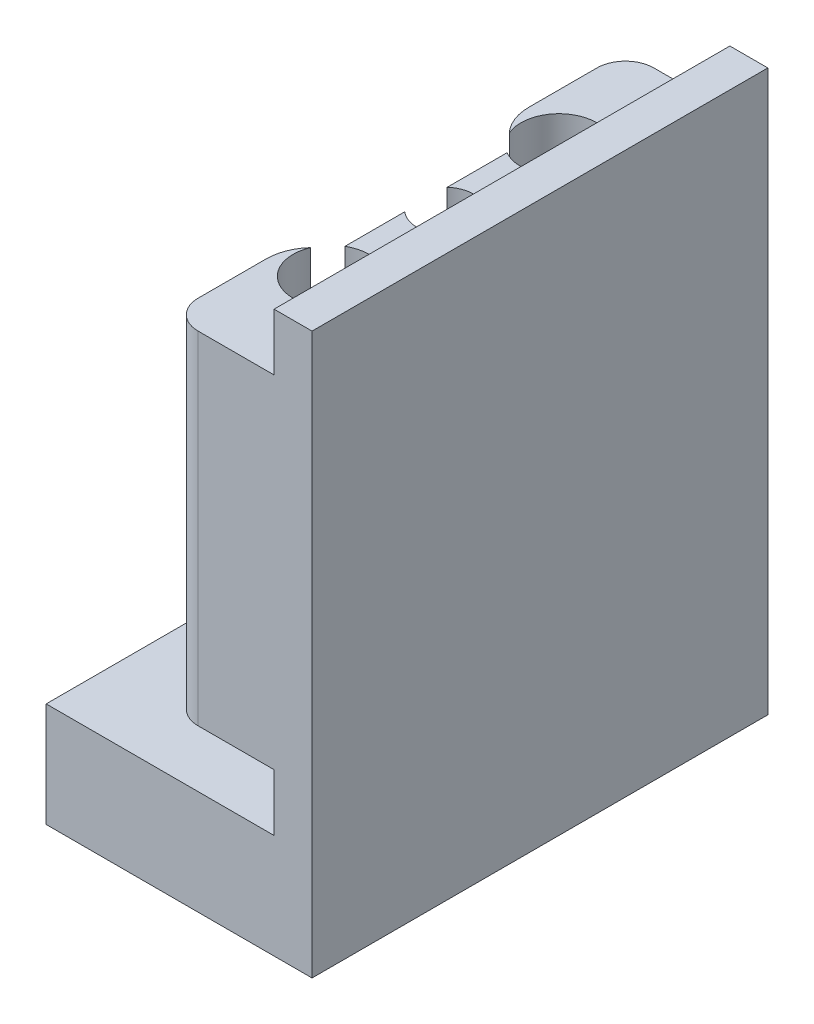
ISO-10303-21;
HEADER;
FILE_DESCRIPTION(('STEP AP214'),'2;1');
FILE_NAME('part.step','',(''),(''),'','','');
FILE_SCHEMA(('AUTOMOTIVE_DESIGN { 1 0 10303 214 1 1 1 1 }'));
ENDSEC;
DATA;
#1=APPLICATION_CONTEXT('core data for automotive mechanical design processes');
#2=APPLICATION_PROTOCOL_DEFINITION('international standard','automotive_design',2000,#1);
#3=PRODUCT_CONTEXT('',#1,'mechanical');
#4=PRODUCT('Part','Part','',(#3));
#5=PRODUCT_RELATED_PRODUCT_CATEGORY('part','',(#4));
#6=PRODUCT_DEFINITION_FORMATION('','',#4);
#7=PRODUCT_DEFINITION_CONTEXT('part definition',#1,'design');
#8=PRODUCT_DEFINITION('design','',#6,#7);
#9=PRODUCT_DEFINITION_SHAPE('','',#8);
#10=(LENGTH_UNIT() NAMED_UNIT(*) SI_UNIT(.MILLI.,.METRE.));
#11=(NAMED_UNIT(*) PLANE_ANGLE_UNIT() SI_UNIT($,.RADIAN.));
#12=(NAMED_UNIT(*) SI_UNIT($,.STERADIAN.) SOLID_ANGLE_UNIT());
#13=UNCERTAINTY_MEASURE_WITH_UNIT(LENGTH_MEASURE(1.E-05),#10,'distance_accuracy_value','');
#14=(GEOMETRIC_REPRESENTATION_CONTEXT(3) GLOBAL_UNCERTAINTY_ASSIGNED_CONTEXT((#13)) GLOBAL_UNIT_ASSIGNED_CONTEXT((#10,
#11,#12)) REPRESENTATION_CONTEXT('',''));
#15=CARTESIAN_POINT('',(0.,0.,0.));
#16=DIRECTION('',(0.,0.,1.));
#17=DIRECTION('',(1.,0.,0.));
#18=AXIS2_PLACEMENT_3D('',#15,#16,#17);
#19=CARTESIAN_POINT('',(2.,0.,0.));
#20=DIRECTION('',(-1.,0.,0.));
#21=DIRECTION('',(0.,0.,1.));
#22=AXIS2_PLACEMENT_3D('',#19,#20,#21);
#23=PLANE('',#22);
#24=DIRECTION('',(0.,1.,0.));
#25=VECTOR('',#24,1.);
#26=CARTESIAN_POINT('',(2.,0.,4.26794919243112));
#27=LINE('',#26,#25);
#28=CARTESIAN_POINT('',(2.,26.5,4.26794919243112));
#29=VERTEX_POINT('',#28);
#30=CARTESIAN_POINT('',(2.,8.5,4.26794919243112));
#31=VERTEX_POINT('',#30);
#32=EDGE_CURVE('E589',#29,#31,#27,.F.);
#33=ORIENTED_EDGE('',*,*,#32,.F.);
#34=DIRECTION('',(0.,0.,-1.));
#35=VECTOR('',#34,1.);
#36=CARTESIAN_POINT('',(2.,26.5,-4.625));
#37=LINE('',#36,#35);
#38=CARTESIAN_POINT('',(2.,26.5,1.1180339887499));
#39=VERTEX_POINT('',#38);
#40=EDGE_CURVE('E198',#29,#39,#37,.T.);
#41=ORIENTED_EDGE('',*,*,#40,.T.);
#42=DIRECTION('',(0.,1.,0.));
#43=VECTOR('',#42,1.);
#44=CARTESIAN_POINT('',(2.,0.,1.1180339887499));
#45=LINE('',#44,#43);
#46=CARTESIAN_POINT('',(2.,8.5,1.1180339887499));
#47=VERTEX_POINT('',#46);
#48=EDGE_CURVE('E292',#47,#39,#45,.T.);
#49=ORIENTED_EDGE('',*,*,#48,.F.);
#50=DIRECTION('',(0.,0.,1.));
#51=VECTOR('',#50,1.);
#52=CARTESIAN_POINT('',(2.,8.5,-4.625));
#53=LINE('',#52,#51);
#54=EDGE_CURVE('E203',#47,#31,#53,.T.);
#55=ORIENTED_EDGE('',*,*,#54,.T.);
#56=EDGE_LOOP('',(#33,#41,#49,#55));
#57=FACE_BOUND('',#56,.T.);
#58=ADVANCED_FACE('F35',(#57),#23,.T.);
#59=CARTESIAN_POINT('',(0.500000000000001,26.5,12.));
#60=DIRECTION('',(1.,0.,0.));
#61=DIRECTION('',(0.,0.,-1.));
#62=AXIS2_PLACEMENT_3D('',#59,#60,#61);
#63=PLANE('',#62);
#64=DIRECTION('',(0.,0.,1.));
#65=VECTOR('',#64,1.);
#66=CARTESIAN_POINT('',(0.500000000000001,26.5,12.));
#67=LINE('',#66,#65);
#68=CARTESIAN_POINT('',(0.500000000000001,26.5,-10.5));
#69=VERTEX_POINT('',#68);
#70=CARTESIAN_POINT('',(0.500000000000001,26.5,-6.91628784747792));
#71=VERTEX_POINT('',#70);
#72=EDGE_CURVE('E214',#69,#71,#67,.T.);
#73=ORIENTED_EDGE('',*,*,#72,.F.);
#74=DIRECTION('',(0.,-1.,0.));
#75=VECTOR('',#74,1.);
#76=CARTESIAN_POINT('',(0.500000000000001,26.5,-10.5));
#77=LINE('',#76,#75);
#78=CARTESIAN_POINT('',(0.500000000000001,8.5,-10.5));
#79=VERTEX_POINT('',#78);
#80=EDGE_CURVE('E294',#69,#79,#77,.T.);
#81=ORIENTED_EDGE('',*,*,#80,.T.);
#82=DIRECTION('',(0.,0.,1.));
#83=VECTOR('',#82,1.);
#84=CARTESIAN_POINT('',(0.500000000000001,8.5,12.));
#85=LINE('',#84,#83);
#86=CARTESIAN_POINT('',(0.500000000000001,8.5,-6.91628784747792));
#87=VERTEX_POINT('',#86);
#88=EDGE_CURVE('E224',#79,#87,#85,.T.);
#89=ORIENTED_EDGE('',*,*,#88,.T.);
#90=DIRECTION('',(0.,1.,0.));
#91=VECTOR('',#90,1.);
#92=CARTESIAN_POINT('',(0.500000000000001,26.5,-6.91628784747792));
#93=LINE('',#92,#91);
#94=EDGE_CURVE('E284',#87,#71,#93,.T.);
#95=ORIENTED_EDGE('',*,*,#94,.T.);
#96=EDGE_LOOP('',(#73,#81,#89,#95));
#97=FACE_BOUND('',#96,.T.);
#98=ADVANCED_FACE('F359',(#97),#63,.F.);
#99=CARTESIAN_POINT('',(6.,29.5,12.));
#100=DIRECTION('',(1.,0.,0.));
#101=DIRECTION('',(0.,0.,-1.));
#102=AXIS2_PLACEMENT_3D('',#99,#100,#101);
#103=PLANE('',#102);
#104=DIRECTION('',(0.,0.,-1.));
#105=VECTOR('',#104,1.);
#106=CARTESIAN_POINT('',(6.,8.5,12.));
#107=LINE('',#106,#105);
#108=CARTESIAN_POINT('',(6.,8.5,12.));
#109=VERTEX_POINT('',#108);
#110=CARTESIAN_POINT('',(6.,8.5,-12.));
#111=VERTEX_POINT('',#110);
#112=EDGE_CURVE('E202',#109,#111,#107,.T.);
#113=ORIENTED_EDGE('',*,*,#112,.T.);
#114=DIRECTION('',(0.,-1.,0.));
#115=VECTOR('',#114,1.);
#116=CARTESIAN_POINT('',(6.,29.5,-12.));
#117=LINE('',#116,#115);
#118=CARTESIAN_POINT('',(6.,5.5,-12.));
#119=VERTEX_POINT('',#118);
#120=EDGE_CURVE('E236',#111,#119,#117,.T.);
#121=ORIENTED_EDGE('',*,*,#120,.T.);
#122=DIRECTION('',(0.,0.,-1.));
#123=VECTOR('',#122,1.);
#124=CARTESIAN_POINT('',(6.,5.5,12.));
#125=LINE('',#124,#123);
#126=CARTESIAN_POINT('',(6.,5.5,12.));
#127=VERTEX_POINT('',#126);
#128=EDGE_CURVE('E252',#127,#119,#125,.T.);
#129=ORIENTED_EDGE('',*,*,#128,.F.);
#130=DIRECTION('',(0.,-1.,0.));
#131=VECTOR('',#130,1.);
#132=CARTESIAN_POINT('',(6.,29.5,12.));
#133=LINE('',#132,#131);
#134=EDGE_CURVE('E247',#109,#127,#133,.T.);
#135=ORIENTED_EDGE('',*,*,#134,.F.);
#136=EDGE_LOOP('',(#113,#121,#129,#135));
#137=FACE_BOUND('',#136,.T.);
#138=ADVANCED_FACE('F320',(#137),#103,.F.);
#139=CARTESIAN_POINT('',(-6.,5.5,-12.));
#140=DIRECTION('',(0.,0.,1.));
#141=DIRECTION('',(1.,0.,0.));
#142=AXIS2_PLACEMENT_3D('',#139,#140,#141);
#143=PLANE('',#142);
#144=DIRECTION('',(-1.,0.,0.));
#145=VECTOR('',#144,1.);
#146=CARTESIAN_POINT('',(6.,8.5,-12.));
#147=LINE('',#146,#145);
#148=CARTESIAN_POINT('',(2.,8.5,-12.));
#149=VERTEX_POINT('',#148);
#150=EDGE_CURVE('E220',#111,#149,#147,.T.);
#151=ORIENTED_EDGE('',*,*,#150,.T.);
#152=DIRECTION('',(0.,-1.,0.));
#153=VECTOR('',#152,1.);
#154=CARTESIAN_POINT('',(2.,5.5,-12.));
#155=LINE('',#154,#153);
#156=CARTESIAN_POINT('',(2.,26.5,-12.));
#157=VERTEX_POINT('',#156);
#158=EDGE_CURVE('E301',#149,#157,#155,.F.);
#159=ORIENTED_EDGE('',*,*,#158,.T.);
#160=DIRECTION('',(-1.,0.,0.));
#161=VECTOR('',#160,1.);
#162=CARTESIAN_POINT('',(6.,26.5,-12.));
#163=LINE('',#162,#161);
#164=CARTESIAN_POINT('',(6.,26.5,-12.));
#165=VERTEX_POINT('',#164);
#166=EDGE_CURVE('E210',#165,#157,#163,.T.);
#167=ORIENTED_EDGE('',*,*,#166,.F.);
#168=CARTESIAN_POINT('',(6.,29.5,-12.));
#169=VERTEX_POINT('',#168);
#170=EDGE_CURVE('E239',#169,#165,#117,.T.);
#171=ORIENTED_EDGE('',*,*,#170,.F.);
#172=DIRECTION('',(-1.,0.,0.));
#173=VECTOR('',#172,1.);
#174=CARTESIAN_POINT('',(6.,29.5,-12.));
#175=LINE('',#174,#173);
#176=CARTESIAN_POINT('',(8.,29.5,-12.));
#177=VERTEX_POINT('',#176);
#178=EDGE_CURVE('E234',#177,#169,#175,.T.);
#179=ORIENTED_EDGE('',*,*,#178,.F.);
#180=DIRECTION('',(0.,-1.,0.));
#181=VECTOR('',#180,1.);
#182=CARTESIAN_POINT('',(8.,29.5,-12.));
#183=LINE('',#182,#181);
#184=CARTESIAN_POINT('',(8.,0.,-12.));
#185=VERTEX_POINT('',#184);
#186=EDGE_CURVE('E241',#177,#185,#183,.T.);
#187=ORIENTED_EDGE('',*,*,#186,.T.);
#188=DIRECTION('',(-1.,0.,0.));
#189=VECTOR('',#188,1.);
#190=CARTESIAN_POINT('',(-6.,0.,-12.));
#191=LINE('',#190,#189);
#192=CARTESIAN_POINT('',(-6.,0.,-12.));
#193=VERTEX_POINT('',#192);
#194=EDGE_CURVE('E251',#185,#193,#191,.T.);
#195=ORIENTED_EDGE('',*,*,#194,.T.);
#196=DIRECTION('',(0.,-1.,0.));
#197=VECTOR('',#196,1.);
#198=CARTESIAN_POINT('',(-6.,5.5,-12.));
#199=LINE('',#198,#197);
#200=CARTESIAN_POINT('',(-6.,5.5,-12.));
#201=VERTEX_POINT('',#200);
#202=EDGE_CURVE('E270',#201,#193,#199,.T.);
#203=ORIENTED_EDGE('',*,*,#202,.F.);
#204=DIRECTION('',(-1.,0.,0.));
#205=VECTOR('',#204,1.);
#206=CARTESIAN_POINT('',(-6.,5.5,-12.));
#207=LINE('',#206,#205);
#208=EDGE_CURVE('E255',#119,#201,#207,.T.);
#209=ORIENTED_EDGE('',*,*,#208,.F.);
#210=ORIENTED_EDGE('',*,*,#120,.F.);
#211=EDGE_LOOP('',(#151,#159,#167,#171,#179,#187,#195,#203,#209,#210));
#212=FACE_BOUND('',#211,.T.);
#213=ADVANCED_FACE('F324',(#212),#143,.F.);
#214=CARTESIAN_POINT('',(-6.,5.5,12.));
#215=DIRECTION('',(1.,0.,0.));
#216=DIRECTION('',(0.,0.,-1.));
#217=AXIS2_PLACEMENT_3D('',#214,#215,#216);
#218=PLANE('',#217);
#219=DIRECTION('',(0.,0.,1.));
#220=VECTOR('',#219,1.);
#221=CARTESIAN_POINT('',(-6.,0.,12.));
#222=LINE('',#221,#220);
#223=CARTESIAN_POINT('',(-6.,0.,12.));
#224=VERTEX_POINT('',#223);
#225=EDGE_CURVE('E265',#193,#224,#222,.T.);
#226=ORIENTED_EDGE('',*,*,#225,.T.);
#227=DIRECTION('',(0.,-1.,0.));
#228=VECTOR('',#227,1.);
#229=CARTESIAN_POINT('',(-6.,5.5,12.));
#230=LINE('',#229,#228);
#231=CARTESIAN_POINT('',(-6.,5.5,12.));
#232=VERTEX_POINT('',#231);
#233=EDGE_CURVE('E263',#232,#224,#230,.T.);
#234=ORIENTED_EDGE('',*,*,#233,.F.);
#235=DIRECTION('',(0.,0.,1.));
#236=VECTOR('',#235,1.);
#237=CARTESIAN_POINT('',(-6.,5.5,12.));
#238=LINE('',#237,#236);
#239=EDGE_CURVE('E258',#201,#232,#238,.T.);
#240=ORIENTED_EDGE('',*,*,#239,.F.);
#241=ORIENTED_EDGE('',*,*,#202,.T.);
#242=EDGE_LOOP('',(#226,#234,#240,#241));
#243=FACE_BOUND('',#242,.T.);
#244=ADVANCED_FACE('F411',(#243),#218,.F.);
#245=CARTESIAN_POINT('',(-6.,5.5,12.));
#246=DIRECTION('',(0.,0.,-1.));
#247=DIRECTION('',(-1.,0.,0.));
#248=AXIS2_PLACEMENT_3D('',#245,#246,#247);
#249=PLANE('',#248);
#250=DIRECTION('',(1.,0.,0.));
#251=VECTOR('',#250,1.);
#252=CARTESIAN_POINT('',(6.,26.5,12.));
#253=LINE('',#252,#251);
#254=CARTESIAN_POINT('',(2.,26.5,12.));
#255=VERTEX_POINT('',#254);
#256=CARTESIAN_POINT('',(6.,26.5,12.));
#257=VERTEX_POINT('',#256);
#258=EDGE_CURVE('E216',#255,#257,#253,.T.);
#259=ORIENTED_EDGE('',*,*,#258,.F.);
#260=DIRECTION('',(0.,-1.,0.));
#261=VECTOR('',#260,1.);
#262=CARTESIAN_POINT('',(2.,5.5,12.));
#263=LINE('',#262,#261);
#264=CARTESIAN_POINT('',(2.,8.5,12.));
#265=VERTEX_POINT('',#264);
#266=EDGE_CURVE('E43',#255,#265,#263,.T.);
#267=ORIENTED_EDGE('',*,*,#266,.T.);
#268=DIRECTION('',(1.,0.,0.));
#269=VECTOR('',#268,1.);
#270=CARTESIAN_POINT('',(6.,8.5,12.));
#271=LINE('',#270,#269);
#272=EDGE_CURVE('E211',#265,#109,#271,.T.);
#273=ORIENTED_EDGE('',*,*,#272,.T.);
#274=ORIENTED_EDGE('',*,*,#134,.T.);
#275=DIRECTION('',(1.,0.,0.));
#276=VECTOR('',#275,1.);
#277=CARTESIAN_POINT('',(-6.,5.5,12.));
#278=LINE('',#277,#276);
#279=EDGE_CURVE('E260',#232,#127,#278,.T.);
#280=ORIENTED_EDGE('',*,*,#279,.F.);
#281=ORIENTED_EDGE('',*,*,#233,.T.);
#282=DIRECTION('',(1.,0.,0.));
#283=VECTOR('',#282,1.);
#284=CARTESIAN_POINT('',(-6.,0.,12.));
#285=LINE('',#284,#283);
#286=CARTESIAN_POINT('',(8.,0.,12.));
#287=VERTEX_POINT('',#286);
#288=EDGE_CURVE('E256',#224,#287,#285,.T.);
#289=ORIENTED_EDGE('',*,*,#288,.T.);
#290=DIRECTION('',(0.,-1.,0.));
#291=VECTOR('',#290,1.);
#292=CARTESIAN_POINT('',(8.,29.5,12.));
#293=LINE('',#292,#291);
#294=CARTESIAN_POINT('',(8.,29.5,12.));
#295=VERTEX_POINT('',#294);
#296=EDGE_CURVE('E244',#295,#287,#293,.T.);
#297=ORIENTED_EDGE('',*,*,#296,.F.);
#298=DIRECTION('',(1.,0.,0.));
#299=VECTOR('',#298,1.);
#300=CARTESIAN_POINT('',(6.,29.5,12.));
#301=LINE('',#300,#299);
#302=CARTESIAN_POINT('',(6.,29.5,12.));
#303=VERTEX_POINT('',#302);
#304=EDGE_CURVE('E230',#303,#295,#301,.T.);
#305=ORIENTED_EDGE('',*,*,#304,.F.);
#306=EDGE_CURVE('E248',#303,#257,#133,.T.);
#307=ORIENTED_EDGE('',*,*,#306,.T.);
#308=EDGE_LOOP('',(#259,#267,#273,#274,#280,#281,#289,#297,#305,#307));
#309=FACE_BOUND('',#308,.T.);
#310=ADVANCED_FACE('F309',(#309),#249,.F.);
#311=CARTESIAN_POINT('',(0.,5.5,0.));
#312=DIRECTION('',(0.,-1.,0.));
#313=DIRECTION('',(0.,0.,-1.));
#314=AXIS2_PLACEMENT_3D('',#311,#312,#313);
#315=PLANE('',#314);
#316=CARTESIAN_POINT('',(3.,5.5,6.));
#317=DIRECTION('',(0.,-1.,0.));
#318=DIRECTION('',(0.,0.,-1.));
#319=AXIS2_PLACEMENT_3D('',#316,#317,#318);
#320=CIRCLE('',#319,2.);
#321=CARTESIAN_POINT('',(3.,5.5,4.));
#322=VERTEX_POINT('',#321);
#323=EDGE_CURVE('E597',#322,#322,#320,.T.);
#324=ORIENTED_EDGE('',*,*,#323,.T.);
#325=EDGE_LOOP('',(#324));
#326=FACE_BOUND('',#325,.T.);
#327=CARTESIAN_POINT('',(3.,5.5,-6.));
#328=DIRECTION('',(0.,-1.,0.));
#329=DIRECTION('',(0.,0.,-1.));
#330=AXIS2_PLACEMENT_3D('',#327,#328,#329);
#331=CIRCLE('',#330,2.);
#332=CARTESIAN_POINT('',(3.,5.5,-8.));
#333=VERTEX_POINT('',#332);
#334=EDGE_CURVE('E182',#333,#333,#331,.T.);
#335=ORIENTED_EDGE('',*,*,#334,.T.);
#336=EDGE_LOOP('',(#335));
#337=FACE_BOUND('',#336,.T.);
#338=CARTESIAN_POINT('',(3.,5.5,0.));
#339=DIRECTION('',(0.,-1.,0.));
#340=DIRECTION('',(0.,0.,-1.));
#341=AXIS2_PLACEMENT_3D('',#338,#339,#340);
#342=CIRCLE('',#341,1.5);
#343=CARTESIAN_POINT('',(3.,5.5,-1.5));
#344=VERTEX_POINT('',#343);
#345=EDGE_CURVE('E604',#344,#344,#342,.T.);
#346=ORIENTED_EDGE('',*,*,#345,.T.);
#347=EDGE_LOOP('',(#346));
#348=FACE_BOUND('',#347,.T.);
#349=ORIENTED_EDGE('',*,*,#128,.T.);
#350=ORIENTED_EDGE('',*,*,#208,.T.);
#351=ORIENTED_EDGE('',*,*,#239,.T.);
#352=ORIENTED_EDGE('',*,*,#279,.T.);
#353=EDGE_LOOP('',(#349,#350,#351,#352));
#354=FACE_BOUND('',#353,.T.);
#355=ADVANCED_FACE('F329',(#326,#337,#348,#354),#315,.F.);
#356=CARTESIAN_POINT('',(0.,0.,0.));
#357=DIRECTION('',(0.,-1.,0.));
#358=DIRECTION('',(0.,0.,-1.));
#359=AXIS2_PLACEMENT_3D('',#356,#357,#358);
#360=PLANE('',#359);
#361=CARTESIAN_POINT('',(3.,0.,6.));
#362=DIRECTION('',(0.,1.,0.));
#363=DIRECTION('',(0.,0.,1.));
#364=AXIS2_PLACEMENT_3D('',#361,#362,#363);
#365=CIRCLE('',#364,2.);
#366=CARTESIAN_POINT('',(3.,0.,8.));
#367=VERTEX_POINT('',#366);
#368=EDGE_CURVE('E616',#367,#367,#365,.T.);
#369=ORIENTED_EDGE('',*,*,#368,.T.);
#370=EDGE_LOOP('',(#369));
#371=FACE_BOUND('',#370,.T.);
#372=CARTESIAN_POINT('',(3.,0.,-6.));
#373=DIRECTION('',(0.,1.,0.));
#374=DIRECTION('',(0.,0.,-1.));
#375=AXIS2_PLACEMENT_3D('',#372,#373,#374);
#376=CIRCLE('',#375,2.);
#377=CARTESIAN_POINT('',(3.,0.,-8.));
#378=VERTEX_POINT('',#377);
#379=EDGE_CURVE('E192',#378,#378,#376,.T.);
#380=ORIENTED_EDGE('',*,*,#379,.T.);
#381=EDGE_LOOP('',(#380));
#382=FACE_BOUND('',#381,.T.);
#383=CARTESIAN_POINT('',(3.,0.,0.));
#384=DIRECTION('',(0.,1.,0.));
#385=DIRECTION('',(0.,0.,1.));
#386=AXIS2_PLACEMENT_3D('',#383,#384,#385);
#387=CIRCLE('',#386,1.5);
#388=CARTESIAN_POINT('',(3.,0.,1.5));
#389=VERTEX_POINT('',#388);
#390=EDGE_CURVE('E193',#389,#389,#387,.T.);
#391=ORIENTED_EDGE('',*,*,#390,.T.);
#392=EDGE_LOOP('',(#391));
#393=FACE_BOUND('',#392,.T.);
#394=ORIENTED_EDGE('',*,*,#194,.F.);
#395=DIRECTION('',(0.,0.,-1.));
#396=VECTOR('',#395,1.);
#397=CARTESIAN_POINT('',(8.,0.,12.));
#398=LINE('',#397,#396);
#399=EDGE_CURVE('E218',#287,#185,#398,.T.);
#400=ORIENTED_EDGE('',*,*,#399,.F.);
#401=ORIENTED_EDGE('',*,*,#288,.F.);
#402=ORIENTED_EDGE('',*,*,#225,.F.);
#403=EDGE_LOOP('',(#394,#400,#401,#402));
#404=FACE_BOUND('',#403,.T.);
#405=ADVANCED_FACE('F338',(#371,#382,#393,#404),#360,.T.);
#406=ORIENTED_EDGE('',*,*,#170,.T.);
#407=DIRECTION('',(0.,0.,-1.));
#408=VECTOR('',#407,1.);
#409=CARTESIAN_POINT('',(6.,26.5,12.));
#410=LINE('',#409,#408);
#411=EDGE_CURVE('E207',#257,#165,#410,.T.);
#412=ORIENTED_EDGE('',*,*,#411,.F.);
#413=ORIENTED_EDGE('',*,*,#306,.F.);
#414=DIRECTION('',(0.,0.,1.));
#415=VECTOR('',#414,1.);
#416=CARTESIAN_POINT('',(6.,29.5,12.));
#417=LINE('',#416,#415);
#418=EDGE_CURVE('E227',#169,#303,#417,.T.);
#419=ORIENTED_EDGE('',*,*,#418,.F.);
#420=EDGE_LOOP('',(#406,#412,#413,#419));
#421=FACE_BOUND('',#420,.T.);
#422=ADVANCED_FACE('F352',(#421),#103,.F.);
#423=CARTESIAN_POINT('',(8.,29.5,12.));
#424=DIRECTION('',(-1.,0.,0.));
#425=DIRECTION('',(0.,0.,1.));
#426=AXIS2_PLACEMENT_3D('',#423,#424,#425);
#427=PLANE('',#426);
#428=ORIENTED_EDGE('',*,*,#399,.T.);
#429=ORIENTED_EDGE('',*,*,#186,.F.);
#430=DIRECTION('',(0.,0.,-1.));
#431=VECTOR('',#430,1.);
#432=CARTESIAN_POINT('',(8.,29.5,12.));
#433=LINE('',#432,#431);
#434=EDGE_CURVE('E232',#295,#177,#433,.T.);
#435=ORIENTED_EDGE('',*,*,#434,.F.);
#436=ORIENTED_EDGE('',*,*,#296,.T.);
#437=EDGE_LOOP('',(#428,#429,#435,#436));
#438=FACE_BOUND('',#437,.T.);
#439=ADVANCED_FACE('F341',(#438),#427,.F.);
#440=CARTESIAN_POINT('',(0.,29.5,0.));
#441=DIRECTION('',(0.,-1.,0.));
#442=DIRECTION('',(0.,0.,-1.));
#443=AXIS2_PLACEMENT_3D('',#440,#441,#442);
#444=PLANE('',#443);
#445=ORIENTED_EDGE('',*,*,#418,.T.);
#446=ORIENTED_EDGE('',*,*,#304,.T.);
#447=ORIENTED_EDGE('',*,*,#434,.T.);
#448=ORIENTED_EDGE('',*,*,#178,.T.);
#449=EDGE_LOOP('',(#445,#446,#447,#448));
#450=FACE_BOUND('',#449,.T.);
#451=ADVANCED_FACE('F348',(#450),#444,.F.);
#452=CARTESIAN_POINT('',(0.500000000000001,8.5,6.91628784747793));
#453=VERTEX_POINT('',#452);
#454=CARTESIAN_POINT('',(0.500000000000001,8.5,10.5));
#455=VERTEX_POINT('',#454);
#456=EDGE_CURVE('E223',#453,#455,#85,.T.);
#457=ORIENTED_EDGE('',*,*,#456,.T.);
#458=DIRECTION('',(0.,-1.,0.));
#459=VECTOR('',#458,1.);
#460=CARTESIAN_POINT('',(0.500000000000001,26.5,10.5));
#461=LINE('',#460,#459);
#462=CARTESIAN_POINT('',(0.500000000000001,26.5,10.5));
#463=VERTEX_POINT('',#462);
#464=EDGE_CURVE('E11',#455,#463,#461,.F.);
#465=ORIENTED_EDGE('',*,*,#464,.T.);
#466=CARTESIAN_POINT('',(0.500000000000001,26.5,6.91628784747792));
#467=VERTEX_POINT('',#466);
#468=EDGE_CURVE('E213',#467,#463,#67,.T.);
#469=ORIENTED_EDGE('',*,*,#468,.F.);
#470=DIRECTION('',(0.,-1.,0.));
#471=VECTOR('',#470,1.);
#472=CARTESIAN_POINT('',(0.500000000000001,26.5,6.91628784747792));
#473=LINE('',#472,#471);
#474=EDGE_CURVE('E276',#467,#453,#473,.T.);
#475=ORIENTED_EDGE('',*,*,#474,.T.);
#476=EDGE_LOOP('',(#457,#465,#469,#475));
#477=FACE_BOUND('',#476,.T.);
#478=ADVANCED_FACE('F383',(#477),#63,.F.);
#479=CARTESIAN_POINT('',(0.,26.5,0.));
#480=DIRECTION('',(0.,1.,0.));
#481=DIRECTION('',(0.,0.,1.));
#482=AXIS2_PLACEMENT_3D('',#479,#480,#481);
#483=PLANE('',#482);
#484=ORIENTED_EDGE('',*,*,#166,.T.);
#485=CARTESIAN_POINT('',(2.,26.5,-10.5));
#486=DIRECTION('',(0.,1.,0.));
#487=DIRECTION('',(0.,0.,1.));
#488=AXIS2_PLACEMENT_3D('',#485,#486,#487);
#489=CIRCLE('',#488,1.5);
#490=EDGE_CURVE('E304',#157,#69,#489,.T.);
#491=ORIENTED_EDGE('',*,*,#490,.T.);
#492=ORIENTED_EDGE('',*,*,#72,.T.);
#493=CARTESIAN_POINT('',(3.,26.5,-6.91628784747792));
#494=DIRECTION('',(0.,1.,0.));
#495=DIRECTION('',(0.,0.,1.));
#496=AXIS2_PLACEMENT_3D('',#493,#494,#495);
#497=CIRCLE('',#496,2.5);
#498=CARTESIAN_POINT('',(1.15401513251041,26.5,-5.23036380737426));
#499=VERTEX_POINT('',#498);
#500=EDGE_CURVE('E191',#71,#499,#497,.T.);
#501=ORIENTED_EDGE('',*,*,#500,.T.);
#502=CARTESIAN_POINT('',(3.,26.5,-6.));
#503=DIRECTION('',(0.,1.,0.));
#504=DIRECTION('',(0.,0.,-1.));
#505=AXIS2_PLACEMENT_3D('',#502,#503,#504);
#506=CIRCLE('',#505,2.);
#507=CARTESIAN_POINT('',(2.,26.5,-4.26794919243112));
#508=VERTEX_POINT('',#507);
#509=EDGE_CURVE('E174',#508,#499,#506,.T.);
#510=ORIENTED_EDGE('',*,*,#509,.F.);
#511=CARTESIAN_POINT('',(2.,26.5,-1.11803398874989));
#512=VERTEX_POINT('',#511);
#513=EDGE_CURVE('E189',#512,#508,#37,.T.);
#514=ORIENTED_EDGE('',*,*,#513,.F.);
#515=CARTESIAN_POINT('',(3.,26.5,0.));
#516=DIRECTION('',(0.,1.,0.));
#517=DIRECTION('',(0.,0.,1.));
#518=AXIS2_PLACEMENT_3D('',#515,#516,#517);
#519=CIRCLE('',#518,1.5);
#520=EDGE_CURVE('E617',#39,#512,#519,.T.);
#521=ORIENTED_EDGE('',*,*,#520,.F.);
#522=ORIENTED_EDGE('',*,*,#40,.F.);
#523=CARTESIAN_POINT('',(3.,26.5,6.));
#524=DIRECTION('',(0.,1.,0.));
#525=DIRECTION('',(0.,0.,1.));
#526=AXIS2_PLACEMENT_3D('',#523,#524,#525);
#527=CIRCLE('',#526,2.);
#528=CARTESIAN_POINT('',(1.15401513251041,26.5,5.23036380737426));
#529=VERTEX_POINT('',#528);
#530=EDGE_CURVE('E594',#529,#29,#527,.T.);
#531=ORIENTED_EDGE('',*,*,#530,.F.);
#532=CARTESIAN_POINT('',(3.,26.5,6.91628784747792));
#533=DIRECTION('',(0.,1.,0.));
#534=DIRECTION('',(0.,0.,1.));
#535=AXIS2_PLACEMENT_3D('',#532,#533,#534);
#536=CIRCLE('',#535,2.5);
#537=EDGE_CURVE('E274',#529,#467,#536,.T.);
#538=ORIENTED_EDGE('',*,*,#537,.T.);
#539=ORIENTED_EDGE('',*,*,#468,.T.);
#540=CARTESIAN_POINT('',(2.,26.5,10.5));
#541=DIRECTION('',(0.,1.,0.));
#542=DIRECTION('',(0.,0.,1.));
#543=AXIS2_PLACEMENT_3D('',#540,#541,#542);
#544=CIRCLE('',#543,1.5);
#545=EDGE_CURVE('E50',#463,#255,#544,.T.);
#546=ORIENTED_EDGE('',*,*,#545,.T.);
#547=ORIENTED_EDGE('',*,*,#258,.T.);
#548=ORIENTED_EDGE('',*,*,#411,.T.);
#549=EDGE_LOOP('',(#484,#491,#492,#501,#510,#514,#521,#522,#531,#538,#539,#546,#547,#548));
#550=FACE_BOUND('',#549,.T.);
#551=ADVANCED_FACE('F187',(#550),#483,.T.);
#552=CARTESIAN_POINT('',(0.,8.5,0.));
#553=DIRECTION('',(0.,1.,0.));
#554=DIRECTION('',(0.,0.,1.));
#555=AXIS2_PLACEMENT_3D('',#552,#553,#554);
#556=PLANE('',#555);
#557=ORIENTED_EDGE('',*,*,#88,.F.);
#558=CARTESIAN_POINT('',(2.,8.5,-10.5));
#559=DIRECTION('',(0.,1.,0.));
#560=DIRECTION('',(0.,0.,1.));
#561=AXIS2_PLACEMENT_3D('',#558,#559,#560);
#562=CIRCLE('',#561,1.5);
#563=EDGE_CURVE('E299',#79,#149,#562,.F.);
#564=ORIENTED_EDGE('',*,*,#563,.T.);
#565=ORIENTED_EDGE('',*,*,#150,.F.);
#566=ORIENTED_EDGE('',*,*,#112,.F.);
#567=ORIENTED_EDGE('',*,*,#272,.F.);
#568=CARTESIAN_POINT('',(2.,8.5,10.5));
#569=DIRECTION('',(0.,1.,0.));
#570=DIRECTION('',(0.,0.,1.));
#571=AXIS2_PLACEMENT_3D('',#568,#569,#570);
#572=CIRCLE('',#571,1.5);
#573=EDGE_CURVE('E297',#265,#455,#572,.F.);
#574=ORIENTED_EDGE('',*,*,#573,.T.);
#575=ORIENTED_EDGE('',*,*,#456,.F.);
#576=CARTESIAN_POINT('',(3.,8.5,6.91628784747793));
#577=DIRECTION('',(0.,1.,0.));
#578=DIRECTION('',(0.,0.,1.));
#579=AXIS2_PLACEMENT_3D('',#576,#577,#578);
#580=CIRCLE('',#579,2.5);
#581=CARTESIAN_POINT('',(1.15401513251041,8.5,5.23036380737427));
#582=VERTEX_POINT('',#581);
#583=EDGE_CURVE('E281',#453,#582,#580,.F.);
#584=ORIENTED_EDGE('',*,*,#583,.T.);
#585=CARTESIAN_POINT('',(3.,8.5,6.));
#586=DIRECTION('',(0.,1.,0.));
#587=DIRECTION('',(0.,0.,1.));
#588=AXIS2_PLACEMENT_3D('',#585,#586,#587);
#589=CIRCLE('',#588,2.);
#590=EDGE_CURVE('E591',#582,#31,#589,.T.);
#591=ORIENTED_EDGE('',*,*,#590,.T.);
#592=ORIENTED_EDGE('',*,*,#54,.F.);
#593=CARTESIAN_POINT('',(3.,8.5,0.));
#594=DIRECTION('',(0.,1.,0.));
#595=DIRECTION('',(0.,0.,1.));
#596=AXIS2_PLACEMENT_3D('',#593,#594,#595);
#597=CIRCLE('',#596,1.5);
#598=CARTESIAN_POINT('',(2.,8.5,-1.11803398874989));
#599=VERTEX_POINT('',#598);
#600=EDGE_CURVE('E606',#47,#599,#597,.T.);
#601=ORIENTED_EDGE('',*,*,#600,.T.);
#602=CARTESIAN_POINT('',(2.,8.5,-4.26794919243112));
#603=VERTEX_POINT('',#602);
#604=EDGE_CURVE('E199',#603,#599,#53,.T.);
#605=ORIENTED_EDGE('',*,*,#604,.F.);
#606=CARTESIAN_POINT('',(3.,8.5,-6.));
#607=DIRECTION('',(0.,1.,0.));
#608=DIRECTION('',(0.,0.,1.));
#609=AXIS2_PLACEMENT_3D('',#606,#607,#608);
#610=CIRCLE('',#609,2.);
#611=CARTESIAN_POINT('',(1.15401513251041,8.5,-5.23036380737426));
#612=VERTEX_POINT('',#611);
#613=EDGE_CURVE('E177',#603,#612,#610,.T.);
#614=ORIENTED_EDGE('',*,*,#613,.T.);
#615=CARTESIAN_POINT('',(3.,8.5,-6.91628784747792));
#616=DIRECTION('',(0.,1.,0.));
#617=DIRECTION('',(0.,0.,1.));
#618=AXIS2_PLACEMENT_3D('',#615,#616,#617);
#619=CIRCLE('',#618,2.5);
#620=EDGE_CURVE('E278',#612,#87,#619,.F.);
#621=ORIENTED_EDGE('',*,*,#620,.T.);
#622=EDGE_LOOP('',(#557,#564,#565,#566,#567,#574,#575,#584,#591,#592,#601,#605,#614,#621));
#623=FACE_BOUND('',#622,.T.);
#624=ADVANCED_FACE('F315',(#623),#556,.F.);
#625=DIRECTION('',(0.,1.,0.));
#626=VECTOR('',#625,1.);
#627=CARTESIAN_POINT('',(2.,0.,-4.26794919243112));
#628=LINE('',#627,#626);
#629=EDGE_CURVE('E171',#603,#508,#628,.T.);
#630=ORIENTED_EDGE('',*,*,#629,.F.);
#631=ORIENTED_EDGE('',*,*,#604,.T.);
#632=DIRECTION('',(0.,1.,0.));
#633=VECTOR('',#632,1.);
#634=CARTESIAN_POINT('',(2.,0.,-1.11803398874989));
#635=LINE('',#634,#633);
#636=EDGE_CURVE('E197',#512,#599,#635,.F.);
#637=ORIENTED_EDGE('',*,*,#636,.F.);
#638=ORIENTED_EDGE('',*,*,#513,.T.);
#639=EDGE_LOOP('',(#630,#631,#637,#638));
#640=FACE_BOUND('',#639,.T.);
#641=ADVANCED_FACE('F196',(#640),#23,.T.);
#642=CARTESIAN_POINT('',(3.,26.5,6.91628784747792));
#643=DIRECTION('',(0.,-1.,0.));
#644=DIRECTION('',(0.,0.,-1.));
#645=AXIS2_PLACEMENT_3D('',#642,#643,#644);
#646=CYLINDRICAL_SURFACE('',#645,2.5);
#647=DIRECTION('',(0.,1.,0.));
#648=VECTOR('',#647,1.);
#649=CARTESIAN_POINT('',(1.15401513251041,13.25,5.23036380737427));
#650=LINE('',#649,#648);
#651=EDGE_CURVE('E289',#582,#529,#650,.T.);
#652=ORIENTED_EDGE('',*,*,#651,.F.);
#653=ORIENTED_EDGE('',*,*,#583,.F.);
#654=ORIENTED_EDGE('',*,*,#474,.F.);
#655=ORIENTED_EDGE('',*,*,#537,.F.);
#656=EDGE_LOOP('',(#652,#653,#654,#655));
#657=FACE_BOUND('',#656,.T.);
#658=ADVANCED_FACE('F365',(#657),#646,.T.);
#659=CARTESIAN_POINT('',(3.,26.5,-6.91628784747792));
#660=DIRECTION('',(0.,1.,0.));
#661=DIRECTION('',(0.,0.,1.));
#662=AXIS2_PLACEMENT_3D('',#659,#660,#661);
#663=CYLINDRICAL_SURFACE('',#662,2.5);
#664=DIRECTION('',(0.,1.,0.));
#665=VECTOR('',#664,1.);
#666=CARTESIAN_POINT('',(1.15401513251041,13.25,-5.23036380737426));
#667=LINE('',#666,#665);
#668=EDGE_CURVE('E287',#499,#612,#667,.F.);
#669=ORIENTED_EDGE('',*,*,#668,.F.);
#670=ORIENTED_EDGE('',*,*,#500,.F.);
#671=ORIENTED_EDGE('',*,*,#94,.F.);
#672=ORIENTED_EDGE('',*,*,#620,.F.);
#673=EDGE_LOOP('',(#669,#670,#671,#672));
#674=FACE_BOUND('',#673,.T.);
#675=ADVANCED_FACE('F363',(#674),#663,.T.);
#676=CARTESIAN_POINT('',(3.,0.,-6.));
#677=DIRECTION('',(0.,1.,0.));
#678=DIRECTION('',(0.,0.,1.));
#679=AXIS2_PLACEMENT_3D('',#676,#677,#678);
#680=CYLINDRICAL_SURFACE('',#679,2.);
#681=ORIENTED_EDGE('',*,*,#629,.T.);
#682=ORIENTED_EDGE('',*,*,#509,.T.);
#683=ORIENTED_EDGE('',*,*,#668,.T.);
#684=ORIENTED_EDGE('',*,*,#613,.F.);
#685=EDGE_LOOP('',(#681,#682,#683,#684));
#686=FACE_BOUND('',#685,.T.);
#687=ADVANCED_FACE('F173',(#686),#680,.F.);
#688=CARTESIAN_POINT('',(3.,0.,6.));
#689=DIRECTION('',(0.,1.,0.));
#690=DIRECTION('',(0.,0.,1.));
#691=AXIS2_PLACEMENT_3D('',#688,#689,#690);
#692=CYLINDRICAL_SURFACE('',#691,2.);
#693=ORIENTED_EDGE('',*,*,#32,.T.);
#694=ORIENTED_EDGE('',*,*,#590,.F.);
#695=ORIENTED_EDGE('',*,*,#651,.T.);
#696=ORIENTED_EDGE('',*,*,#530,.T.);
#697=EDGE_LOOP('',(#693,#694,#695,#696));
#698=FACE_BOUND('',#697,.T.);
#699=ADVANCED_FACE('F371',(#698),#692,.F.);
#700=CARTESIAN_POINT('',(3.,0.,0.));
#701=DIRECTION('',(0.,1.,0.));
#702=DIRECTION('',(0.,0.,1.));
#703=AXIS2_PLACEMENT_3D('',#700,#701,#702);
#704=CYLINDRICAL_SURFACE('',#703,1.5);
#705=ORIENTED_EDGE('',*,*,#48,.T.);
#706=ORIENTED_EDGE('',*,*,#520,.T.);
#707=ORIENTED_EDGE('',*,*,#636,.T.);
#708=ORIENTED_EDGE('',*,*,#600,.F.);
#709=EDGE_LOOP('',(#705,#706,#707,#708));
#710=FACE_BOUND('',#709,.T.);
#711=ADVANCED_FACE('F492',(#710),#704,.F.);
#712=ORIENTED_EDGE('',*,*,#390,.F.);
#713=EDGE_LOOP('',(#712));
#714=FACE_BOUND('',#713,.T.);
#715=ORIENTED_EDGE('',*,*,#345,.F.);
#716=EDGE_LOOP('',(#715));
#717=FACE_BOUND('',#716,.T.);
#718=ADVANCED_FACE('F485',(#714,#717),#704,.F.);
#719=ORIENTED_EDGE('',*,*,#379,.F.);
#720=EDGE_LOOP('',(#719));
#721=FACE_BOUND('',#720,.T.);
#722=ORIENTED_EDGE('',*,*,#334,.F.);
#723=EDGE_LOOP('',(#722));
#724=FACE_BOUND('',#723,.T.);
#725=ADVANCED_FACE('F373',(#721,#724),#680,.F.);
#726=ORIENTED_EDGE('',*,*,#368,.F.);
#727=EDGE_LOOP('',(#726));
#728=FACE_BOUND('',#727,.T.);
#729=ORIENTED_EDGE('',*,*,#323,.F.);
#730=EDGE_LOOP('',(#729));
#731=FACE_BOUND('',#730,.T.);
#732=ADVANCED_FACE('F433',(#728,#731),#692,.F.);
#733=CARTESIAN_POINT('',(2.,26.5,-10.5));
#734=DIRECTION('',(0.,-1.,0.));
#735=DIRECTION('',(0.,0.,-1.));
#736=AXIS2_PLACEMENT_3D('',#733,#734,#735);
#737=CYLINDRICAL_SURFACE('',#736,1.5);
#738=ORIENTED_EDGE('',*,*,#490,.F.);
#739=ORIENTED_EDGE('',*,*,#158,.F.);
#740=ORIENTED_EDGE('',*,*,#563,.F.);
#741=ORIENTED_EDGE('',*,*,#80,.F.);
#742=EDGE_LOOP('',(#738,#739,#740,#741));
#743=FACE_BOUND('',#742,.T.);
#744=ADVANCED_FACE('F357',(#743),#737,.T.);
#745=CARTESIAN_POINT('',(2.,5.5,10.5));
#746=DIRECTION('',(0.,-1.,0.));
#747=DIRECTION('',(0.,0.,-1.));
#748=AXIS2_PLACEMENT_3D('',#745,#746,#747);
#749=CYLINDRICAL_SURFACE('',#748,1.5);
#750=ORIENTED_EDGE('',*,*,#545,.F.);
#751=ORIENTED_EDGE('',*,*,#464,.F.);
#752=ORIENTED_EDGE('',*,*,#573,.F.);
#753=ORIENTED_EDGE('',*,*,#266,.F.);
#754=EDGE_LOOP('',(#750,#751,#752,#753));
#755=FACE_BOUND('',#754,.T.);
#756=ADVANCED_FACE('F37',(#755),#749,.T.);
#757=CLOSED_SHELL('',(#58,#98,#138,#213,#244,#310,#355,#405,#422,#439,#451,#478,#551,#624,#641,
#658,#675,#687,#699,#711,#718,#725,#732,#744,#756));
#758=MANIFOLD_SOLID_BREP('B2',#757);
#759=ADVANCED_BREP_SHAPE_REPRESENTATION('',(#18,#758),#14);
#760=SHAPE_DEFINITION_REPRESENTATION(#9,#759);
ENDSEC;
END-ISO-10303-21;
